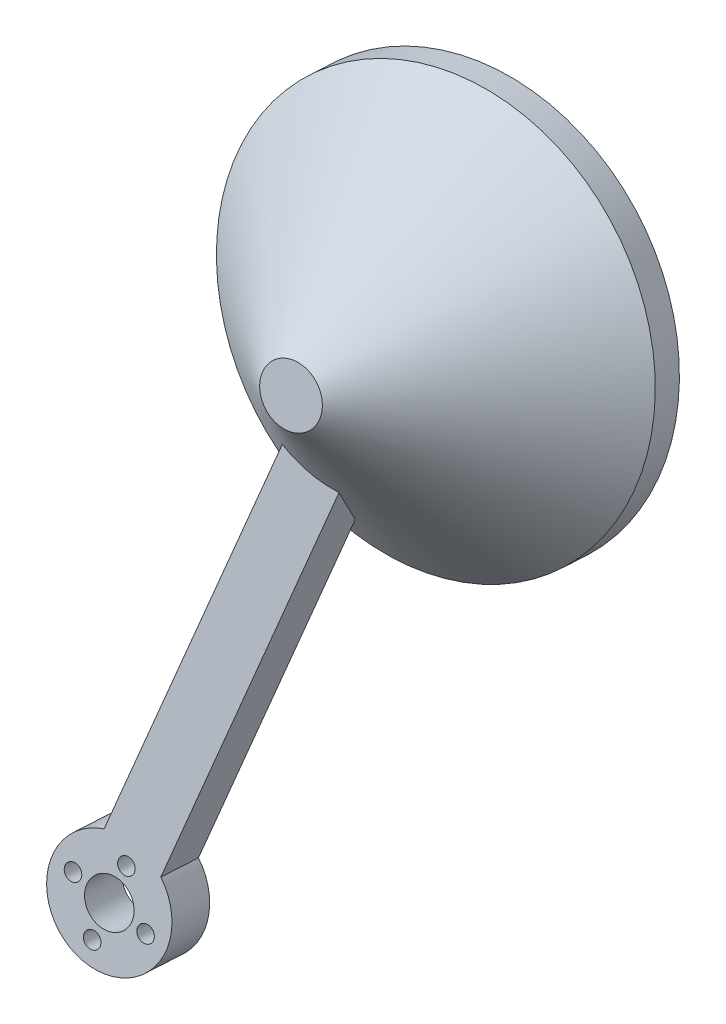
ISO-10303-21;
HEADER;
FILE_DESCRIPTION(('STEP AP214'),'2;1');
FILE_NAME('part.step','',(''),(''),'','','');
FILE_SCHEMA(('AUTOMOTIVE_DESIGN { 1 0 10303 214 1 1 1 1 }'));
ENDSEC;
DATA;
#1=APPLICATION_CONTEXT('core data for automotive mechanical design processes');
#2=APPLICATION_PROTOCOL_DEFINITION('international standard','automotive_design',2000,#1);
#3=PRODUCT_CONTEXT('',#1,'mechanical');
#4=PRODUCT('Part','Part','',(#3));
#5=PRODUCT_RELATED_PRODUCT_CATEGORY('part','',(#4));
#6=PRODUCT_DEFINITION_FORMATION('','',#4);
#7=PRODUCT_DEFINITION_CONTEXT('part definition',#1,'design');
#8=PRODUCT_DEFINITION('design','',#6,#7);
#9=PRODUCT_DEFINITION_SHAPE('','',#8);
#10=(LENGTH_UNIT() NAMED_UNIT(*) SI_UNIT(.MILLI.,.METRE.));
#11=(NAMED_UNIT(*) PLANE_ANGLE_UNIT() SI_UNIT($,.RADIAN.));
#12=(NAMED_UNIT(*) SI_UNIT($,.STERADIAN.) SOLID_ANGLE_UNIT());
#13=UNCERTAINTY_MEASURE_WITH_UNIT(LENGTH_MEASURE(1.E-05),#10,'distance_accuracy_value','');
#14=(GEOMETRIC_REPRESENTATION_CONTEXT(3) GLOBAL_UNCERTAINTY_ASSIGNED_CONTEXT((#13)) GLOBAL_UNIT_ASSIGNED_CONTEXT((#10,
#11,#12)) REPRESENTATION_CONTEXT('',''));
#15=CARTESIAN_POINT('',(0.,0.,0.));
#16=DIRECTION('',(0.,0.,1.));
#17=DIRECTION('',(1.,0.,0.));
#18=AXIS2_PLACEMENT_3D('',#15,#16,#17);
#19=CARTESIAN_POINT('',(1.94447874397873,-131.547241069375,14.3765382991109));
#20=DIRECTION('',(-0.116474855844791,-0.165016264225995,-0.979389218082797));
#21=DIRECTION('',(-0.951304696198871,0.301897346700111,0.0622685076536023));
#22=AXIS2_PLACEMENT_3D('',#19,#20,#21);
#23=PLANE('',#22);
#24=CARTESIAN_POINT('',(9.37461493685242,-107.102475734897,9.37422889352119));
#25=DIRECTION('',(-0.116474855844791,-0.165016264225995,-0.979389218082797));
#26=DIRECTION('',(0.,0.986100975614506,-0.166147121227302));
#27=AXIS2_PLACEMENT_3D('',#24,#25,#26);
#28=CIRCLE('',#27,5.08);
#29=CARTESIAN_POINT('',(9.37461493685242,-102.093082778776,8.5302015176865));
#30=VERTEX_POINT('',#29);
#31=EDGE_CURVE('P0_E149',#30,#30,#28,.T.);
#32=ORIENTED_EDGE('',*,*,#31,.F.);
#33=EDGE_LOOP('',(#32));
#34=FACE_BOUND('',#33,.T.);
#35=CARTESIAN_POINT('',(-5.78772582672569,-129.093419435396,14.8826567293194));
#36=DIRECTION('',(-0.116474855844791,-0.165016264225995,-0.979389218082797));
#37=DIRECTION('',(-0.951304696198871,0.301897346700111,0.0622685076536023));
#38=AXIS2_PLACEMENT_3D('',#35,#36,#37);
#39=CIRCLE('',#38,1.778);
#40=CARTESIAN_POINT('',(-7.47914557656728,-128.556645952963,14.9933701359275));
#41=VERTEX_POINT('',#40);
#42=EDGE_CURVE('P0_E134',#41,#41,#39,.T.);
#43=ORIENTED_EDGE('',*,*,#42,.F.);
#44=EDGE_LOOP('',(#43));
#45=FACE_BOUND('',#44,.T.);
#46=CARTESIAN_POINT('',(9.67668331468316,-134.001062703353,13.8704198689024));
#47=DIRECTION('',(-0.116474855844791,-0.165016264225995,-0.979389218082797));
#48=DIRECTION('',(-0.951304696198871,0.301897346700111,0.0622685076536023));
#49=AXIS2_PLACEMENT_3D('',#46,#47,#48);
#50=CIRCLE('',#49,1.778);
#51=CARTESIAN_POINT('',(7.98526356484157,-133.46428922092,13.9811332755105));
#52=VERTEX_POINT('',#51);
#53=EDGE_CURVE('P0_E122',#52,#52,#50,.T.);
#54=ORIENTED_EDGE('',*,*,#53,.F.);
#55=EDGE_LOOP('',(#54));
#56=FACE_BOUND('',#55,.T.);
#57=DIRECTION('',(0.285399689813967,0.938950278021328,-0.192144197044203));
#58=VECTOR('',#57,1.);
#59=CARTESIAN_POINT('',(-0.957331130423199,-119.303127038386,12.6586410236697));
#60=LINE('',#59,#58);
#61=CARTESIAN_POINT('',(-0.957331130423202,-119.303127038386,12.6586410236697));
#62=VERTEX_POINT('',#61);
#63=CARTESIAN_POINT('',(23.5229635188897,-38.7642186674649,-3.8226192112794));
#64=VERTEX_POINT('',#63);
#65=EDGE_CURVE('P0_E92',#62,#64,#60,.T.);
#66=ORIENTED_EDGE('',*,*,#65,.T.);
#67=DIRECTION('',(0.951304696198871,-0.301897346700111,-0.0622685076536023));
#68=VECTOR('',#67,1.);
#69=CARTESIAN_POINT('',(35.6045331606154,-42.5983149705563,-4.61342925848015));
#70=LINE('',#69,#68);
#71=CARTESIAN_POINT('',(35.6045331606154,-42.5983149705563,-4.61342925848015));
#72=VERTEX_POINT('',#71);
#73=EDGE_CURVE('P0_E87',#64,#72,#70,.T.);
#74=ORIENTED_EDGE('',*,*,#73,.T.);
#75=DIRECTION('',(-0.285399689813967,-0.938950278021328,0.192144197044203));
#76=VECTOR('',#75,1.);
#77=CARTESIAN_POINT('',(11.1242385113025,-123.137223341477,11.867830976469));
#78=LINE('',#77,#76);
#79=CARTESIAN_POINT('',(11.1242385113025,-123.137223341477,11.867830976469));
#80=VERTEX_POINT('',#79);
#81=EDGE_CURVE('P0_E90',#72,#80,#78,.T.);
#82=ORIENTED_EDGE('',*,*,#81,.T.);
#83=CARTESIAN_POINT('',(1.94447874397873,-131.547241069375,14.3765382991109));
#84=DIRECTION('',(-0.116474855844791,-0.165016264225995,-0.979389218082797));
#85=DIRECTION('',(-0.951304696198871,0.301897346700111,0.0622685076536023));
#86=AXIS2_PLACEMENT_3D('',#83,#84,#85);
#87=CIRCLE('',#86,12.7);
#88=EDGE_CURVE('P0_E57',#80,#62,#87,.T.);
#89=ORIENTED_EDGE('',*,*,#88,.T.);
#90=EDGE_LOOP('',(#66,#74,#82,#89));
#91=FACE_BOUND('',#90,.T.);
#92=CARTESIAN_POINT('',(1.94447874397873,-131.547241069375,14.3765382991109));
#93=DIRECTION('',(-0.116474855844791,-0.165016264225995,-0.979389218082797));
#94=DIRECTION('',(-0.951304696198871,0.301897346700111,0.0622685076536023));
#95=AXIS2_PLACEMENT_3D('',#92,#93,#94);
#96=CIRCLE('',#95,5.0165);
#97=CARTESIAN_POINT('',(-2.8277412645029,-130.032773029654,14.6889082677552));
#98=VERTEX_POINT('',#97);
#99=EDGE_CURVE('P0_E107',#98,#98,#96,.T.);
#100=ORIENTED_EDGE('',*,*,#99,.F.);
#101=EDGE_LOOP('',(#100));
#102=FACE_BOUND('',#101,.T.);
#103=CARTESIAN_POINT('',(4.26420742278666,-123.915453209617,12.8147902655356));
#104=DIRECTION('',(-0.116474855844791,-0.165016264225995,-0.979389218082797));
#105=DIRECTION('',(-0.951304696198871,0.301897346700111,0.0622685076536023));
#106=AXIS2_PLACEMENT_3D('',#103,#104,#105);
#107=CIRCLE('',#106,1.77800000000001);
#108=CARTESIAN_POINT('',(2.57278767294506,-123.378679727185,12.9255036721437));
#109=VERTEX_POINT('',#108);
#110=EDGE_CURVE('P0_E128',#109,#109,#107,.T.);
#111=ORIENTED_EDGE('',*,*,#110,.F.);
#112=EDGE_LOOP('',(#111));
#113=FACE_BOUND('',#112,.T.);
#114=CARTESIAN_POINT('',(-0.375249934829194,-139.179028929132,15.9382863326862));
#115=DIRECTION('',(-0.116474855844791,-0.165016264225995,-0.979389218082797));
#116=DIRECTION('',(-0.951304696198871,0.301897346700111,0.0622685076536023));
#117=AXIS2_PLACEMENT_3D('',#114,#115,#116);
#118=CIRCLE('',#117,1.778);
#119=CARTESIAN_POINT('',(-2.06666968467079,-138.642255446699,16.0489997392943));
#120=VERTEX_POINT('',#119);
#121=EDGE_CURVE('P0_E140',#120,#120,#118,.T.);
#122=ORIENTED_EDGE('',*,*,#121,.F.);
#123=EDGE_LOOP('',(#122));
#124=FACE_BOUND('',#123,.T.);
#125=ADVANCED_FACE('P0_F40',(#34,#45,#56,#91,#102,#113,#124),#23,.T.);
#126=CARTESIAN_POINT('',(3.09827866597724,-129.912589955952,24.0783678934391));
#127=DIRECTION('',(-0.116474855844791,-0.165016264225995,-0.979389218082797));
#128=DIRECTION('',(-0.951304696198871,0.301897346700111,0.0622685076536023));
#129=AXIS2_PLACEMENT_3D('',#126,#127,#128);
#130=PLANE('',#129);
#131=DIRECTION('',(0.285399689813967,0.938950278021328,-0.192144197044203));
#132=VECTOR('',#131,1.);
#133=CARTESIAN_POINT('',(0.196468791575304,-117.668475924963,22.3604706179979));
#134=LINE('',#133,#132);
#135=CARTESIAN_POINT('',(0.1964687915753,-117.668475924963,22.3604706179979));
#136=VERTEX_POINT('',#135);
#137=CARTESIAN_POINT('',(24.6767634408882,-37.1295675540422,5.87921038304878));
#138=VERTEX_POINT('',#137);
#139=EDGE_CURVE('P0_E104',#136,#138,#134,.T.);
#140=ORIENTED_EDGE('',*,*,#139,.F.);
#141=CARTESIAN_POINT('',(3.09827866597724,-129.912589955952,24.0783678934391));
#142=DIRECTION('',(-0.116474855844791,-0.165016264225995,-0.979389218082797));
#143=DIRECTION('',(-0.951304696198871,0.301897346700111,0.0622685076536023));
#144=AXIS2_PLACEMENT_3D('',#141,#142,#143);
#145=CIRCLE('',#144,12.7);
#146=CARTESIAN_POINT('',(12.278038433301,-121.502572228055,21.5696605707971));
#147=VERTEX_POINT('',#146);
#148=EDGE_CURVE('P0_E80',#147,#136,#145,.T.);
#149=ORIENTED_EDGE('',*,*,#148,.F.);
#150=DIRECTION('',(-0.285399689813967,-0.938950278021328,0.192144197044203));
#151=VECTOR('',#150,1.);
#152=CARTESIAN_POINT('',(12.278038433301,-121.502572228055,21.5696605707971));
#153=LINE('',#152,#151);
#154=CARTESIAN_POINT('',(36.7583330826139,-40.9636638571336,5.08840033584803));
#155=VERTEX_POINT('',#154);
#156=EDGE_CURVE('P0_E74',#155,#147,#153,.T.);
#157=ORIENTED_EDGE('',*,*,#156,.F.);
#158=DIRECTION('',(0.951304696198871,-0.301897346700111,-0.0622685076536023));
#159=VECTOR('',#158,1.);
#160=CARTESIAN_POINT('',(36.7583330826139,-40.9636638571336,5.08840033584803));
#161=LINE('',#160,#159);
#162=EDGE_CURVE('P0_E96',#138,#155,#161,.T.);
#163=ORIENTED_EDGE('',*,*,#162,.F.);
#164=EDGE_LOOP('',(#140,#149,#157,#163));
#165=FACE_BOUND('',#164,.T.);
#166=CARTESIAN_POINT('',(3.09827866597724,-129.912589955952,24.0783678934391));
#167=DIRECTION('',(-0.116474855844791,-0.165016264225995,-0.979389218082797));
#168=DIRECTION('',(-0.951304696198871,0.301897346700111,0.0622685076536023));
#169=AXIS2_PLACEMENT_3D('',#166,#167,#168);
#170=CIRCLE('',#169,5.0165);
#171=CARTESIAN_POINT('',(-1.6739413425044,-128.398121916231,24.3907378620834));
#172=VERTEX_POINT('',#171);
#173=EDGE_CURVE('P0_E119',#172,#172,#170,.T.);
#174=ORIENTED_EDGE('',*,*,#173,.T.);
#175=EDGE_LOOP('',(#174));
#176=FACE_BOUND('',#175,.T.);
#177=CARTESIAN_POINT('',(10.8304832366817,-132.366411589931,23.5722494632306));
#178=DIRECTION('',(-0.116474855844791,-0.165016264225995,-0.979389218082797));
#179=DIRECTION('',(-0.951304696198871,0.301897346700111,0.0622685076536023));
#180=AXIS2_PLACEMENT_3D('',#177,#178,#179);
#181=CIRCLE('',#180,1.778);
#182=CARTESIAN_POINT('',(9.13906348684007,-131.829638107498,23.6829628698387));
#183=VERTEX_POINT('',#182);
#184=EDGE_CURVE('P0_E125',#183,#183,#181,.T.);
#185=ORIENTED_EDGE('',*,*,#184,.T.);
#186=EDGE_LOOP('',(#185));
#187=FACE_BOUND('',#186,.T.);
#188=CARTESIAN_POINT('',(5.41800734478516,-122.280802096195,22.5166198598638));
#189=DIRECTION('',(-0.116474855844791,-0.165016264225995,-0.979389218082797));
#190=DIRECTION('',(-0.951304696198871,0.301897346700111,0.0622685076536023));
#191=AXIS2_PLACEMENT_3D('',#188,#189,#190);
#192=CIRCLE('',#191,1.77800000000001);
#193=CARTESIAN_POINT('',(3.72658759494356,-121.744028613762,22.6273332664719));
#194=VERTEX_POINT('',#193);
#195=EDGE_CURVE('P0_E131',#194,#194,#192,.T.);
#196=ORIENTED_EDGE('',*,*,#195,.T.);
#197=EDGE_LOOP('',(#196));
#198=FACE_BOUND('',#197,.T.);
#199=CARTESIAN_POINT('',(-4.63392590472719,-127.458768321974,24.5844863236475));
#200=DIRECTION('',(-0.116474855844791,-0.165016264225995,-0.979389218082797));
#201=DIRECTION('',(-0.951304696198871,0.301897346700111,0.0622685076536023));
#202=AXIS2_PLACEMENT_3D('',#199,#200,#201);
#203=CIRCLE('',#202,1.778);
#204=CARTESIAN_POINT('',(-6.32534565456878,-126.921994839541,24.6951997302556));
#205=VERTEX_POINT('',#204);
#206=EDGE_CURVE('P0_E137',#205,#205,#203,.T.);
#207=ORIENTED_EDGE('',*,*,#206,.T.);
#208=EDGE_LOOP('',(#207));
#209=FACE_BOUND('',#208,.T.);
#210=CARTESIAN_POINT('',(0.778549987169308,-137.544377815709,25.6401159270143));
#211=DIRECTION('',(-0.116474855844791,-0.165016264225995,-0.979389218082797));
#212=DIRECTION('',(-0.951304696198871,0.301897346700111,0.0622685076536023));
#213=AXIS2_PLACEMENT_3D('',#210,#211,#212);
#214=CIRCLE('',#213,1.778);
#215=CARTESIAN_POINT('',(-0.912869762672288,-137.007604333277,25.7508293336225));
#216=VERTEX_POINT('',#215);
#217=EDGE_CURVE('P0_E143',#216,#216,#214,.T.);
#218=ORIENTED_EDGE('',*,*,#217,.T.);
#219=EDGE_LOOP('',(#218));
#220=FACE_BOUND('',#219,.T.);
#221=ADVANCED_FACE('P0_F115',(#165,#176,#187,#198,#209,#220),#130,.F.);
#222=CARTESIAN_POINT('',(-0.957331130423199,-119.303127038386,12.6586410236697));
#223=DIRECTION('',(0.951304696198871,-0.301897346700111,-0.0622685076536023));
#224=DIRECTION('',(-0.285399689813967,-0.938950278021328,0.192144197044203));
#225=AXIS2_PLACEMENT_3D('',#222,#223,#224);
#226=PLANE('',#225);
#227=ORIENTED_EDGE('',*,*,#139,.T.);
#228=DIRECTION('',(0.116474855844791,0.165016264225995,0.979389218082797));
#229=VECTOR('',#228,1.);
#230=CARTESIAN_POINT('',(23.5229635188897,-38.7642186674649,-3.8226192112794));
#231=LINE('',#230,#229);
#232=EDGE_CURVE('P0_E11',#64,#138,#231,.T.);
#233=ORIENTED_EDGE('',*,*,#232,.F.);
#234=ORIENTED_EDGE('',*,*,#65,.F.);
#235=DIRECTION('',(0.116474855844791,0.165016264225995,0.979389218082797));
#236=VECTOR('',#235,1.);
#237=CARTESIAN_POINT('',(-0.957331130423202,-119.303127038386,12.6586410236697));
#238=LINE('',#237,#236);
#239=EDGE_CURVE('P0_E100',#62,#136,#238,.T.);
#240=ORIENTED_EDGE('',*,*,#239,.T.);
#241=EDGE_LOOP('',(#227,#233,#234,#240));
#242=FACE_BOUND('',#241,.T.);
#243=ADVANCED_FACE('P0_F42',(#242),#226,.F.);
#244=CARTESIAN_POINT('',(35.6045331606154,-42.5983149705563,-4.61342925848015));
#245=DIRECTION('',(-0.285399689813967,-0.938950278021328,0.192144197044203));
#246=DIRECTION('',(-0.951304696198871,0.301897346700111,0.0622685076536023));
#247=AXIS2_PLACEMENT_3D('',#244,#245,#246);
#248=PLANE('',#247);
#249=ORIENTED_EDGE('',*,*,#162,.T.);
#250=DIRECTION('',(0.116474855844791,0.165016264225995,0.979389218082797));
#251=VECTOR('',#250,1.);
#252=CARTESIAN_POINT('',(35.6045331606154,-42.5983149705563,-4.61342925848015));
#253=LINE('',#252,#251);
#254=EDGE_CURVE('P0_E49',#72,#155,#253,.T.);
#255=ORIENTED_EDGE('',*,*,#254,.F.);
#256=ORIENTED_EDGE('',*,*,#73,.F.);
#257=ORIENTED_EDGE('',*,*,#232,.T.);
#258=EDGE_LOOP('',(#249,#255,#256,#257));
#259=FACE_BOUND('',#258,.T.);
#260=ADVANCED_FACE('P0_F95',(#259),#248,.F.);
#261=CARTESIAN_POINT('',(11.1242385113025,-123.137223341477,11.867830976469));
#262=DIRECTION('',(-0.951304696198871,0.301897346700111,0.0622685076536023));
#263=DIRECTION('',(0.116474855844791,0.165016264225995,0.979389218082797));
#264=AXIS2_PLACEMENT_3D('',#261,#262,#263);
#265=PLANE('',#264);
#266=ORIENTED_EDGE('',*,*,#156,.T.);
#267=DIRECTION('',(0.116474855844791,0.165016264225995,0.979389218082797));
#268=VECTOR('',#267,1.);
#269=CARTESIAN_POINT('',(11.1242385113025,-123.137223341477,11.867830976469));
#270=LINE('',#269,#268);
#271=EDGE_CURVE('P0_E97',#80,#147,#270,.T.);
#272=ORIENTED_EDGE('',*,*,#271,.F.);
#273=ORIENTED_EDGE('',*,*,#81,.F.);
#274=ORIENTED_EDGE('',*,*,#254,.T.);
#275=EDGE_LOOP('',(#266,#272,#273,#274));
#276=FACE_BOUND('',#275,.T.);
#277=ADVANCED_FACE('P0_F98',(#276),#265,.F.);
#278=CARTESIAN_POINT('',(1.94447874397873,-131.547241069375,14.3765382991109));
#279=DIRECTION('',(0.116474855844791,0.165016264225995,0.979389218082797));
#280=DIRECTION('',(0.951304696198871,-0.301897346700111,-0.0622685076536023));
#281=AXIS2_PLACEMENT_3D('',#278,#279,#280);
#282=CYLINDRICAL_SURFACE('',#281,12.7);
#283=ORIENTED_EDGE('',*,*,#148,.T.);
#284=ORIENTED_EDGE('',*,*,#239,.F.);
#285=ORIENTED_EDGE('',*,*,#88,.F.);
#286=ORIENTED_EDGE('',*,*,#271,.T.);
#287=EDGE_LOOP('',(#283,#284,#285,#286));
#288=FACE_BOUND('',#287,.T.);
#289=ADVANCED_FACE('P0_F112',(#288),#282,.T.);
#290=CARTESIAN_POINT('',(1.94447874397873,-131.547241069375,14.3765382991109));
#291=DIRECTION('',(0.116474855844791,0.165016264225995,0.979389218082797));
#292=DIRECTION('',(0.951304696198871,-0.301897346700111,-0.0622685076536023));
#293=AXIS2_PLACEMENT_3D('',#290,#291,#292);
#294=CYLINDRICAL_SURFACE('',#293,5.0165);
#295=ORIENTED_EDGE('',*,*,#99,.T.);
#296=EDGE_LOOP('',(#295));
#297=FACE_BOUND('',#296,.T.);
#298=ORIENTED_EDGE('',*,*,#173,.F.);
#299=EDGE_LOOP('',(#298));
#300=FACE_BOUND('',#299,.T.);
#301=ADVANCED_FACE('P0_F175',(#297,#300),#294,.F.);
#302=CARTESIAN_POINT('',(9.67668331468316,-134.001062703353,13.8704198689024));
#303=DIRECTION('',(0.116474855844791,0.165016264225995,0.979389218082797));
#304=DIRECTION('',(0.951304696198871,-0.301897346700111,-0.0622685076536023));
#305=AXIS2_PLACEMENT_3D('',#302,#303,#304);
#306=CYLINDRICAL_SURFACE('',#305,1.778);
#307=ORIENTED_EDGE('',*,*,#53,.T.);
#308=EDGE_LOOP('',(#307));
#309=FACE_BOUND('',#308,.T.);
#310=ORIENTED_EDGE('',*,*,#184,.F.);
#311=EDGE_LOOP('',(#310));
#312=FACE_BOUND('',#311,.T.);
#313=ADVANCED_FACE('P0_F171',(#309,#312),#306,.F.);
#314=CARTESIAN_POINT('',(4.26420742278666,-123.915453209617,12.8147902655356));
#315=DIRECTION('',(0.116474855844791,0.165016264225995,0.979389218082797));
#316=DIRECTION('',(0.951304696198871,-0.301897346700111,-0.0622685076536023));
#317=AXIS2_PLACEMENT_3D('',#314,#315,#316);
#318=CYLINDRICAL_SURFACE('',#317,1.77800000000001);
#319=ORIENTED_EDGE('',*,*,#110,.T.);
#320=EDGE_LOOP('',(#319));
#321=FACE_BOUND('',#320,.T.);
#322=ORIENTED_EDGE('',*,*,#195,.F.);
#323=EDGE_LOOP('',(#322));
#324=FACE_BOUND('',#323,.T.);
#325=ADVANCED_FACE('P0_F174',(#321,#324),#318,.F.);
#326=CARTESIAN_POINT('',(-5.78772582672569,-129.093419435396,14.8826567293194));
#327=DIRECTION('',(0.116474855844791,0.165016264225995,0.979389218082797));
#328=DIRECTION('',(0.951304696198871,-0.301897346700111,-0.0622685076536023));
#329=AXIS2_PLACEMENT_3D('',#326,#327,#328);
#330=CYLINDRICAL_SURFACE('',#329,1.778);
#331=ORIENTED_EDGE('',*,*,#42,.T.);
#332=EDGE_LOOP('',(#331));
#333=FACE_BOUND('',#332,.T.);
#334=ORIENTED_EDGE('',*,*,#206,.F.);
#335=EDGE_LOOP('',(#334));
#336=FACE_BOUND('',#335,.T.);
#337=ADVANCED_FACE('P0_F189',(#333,#336),#330,.F.);
#338=CARTESIAN_POINT('',(-0.375249934829194,-139.179028929132,15.9382863326862));
#339=DIRECTION('',(0.116474855844791,0.165016264225995,0.979389218082797));
#340=DIRECTION('',(0.951304696198871,-0.301897346700111,-0.0622685076536023));
#341=AXIS2_PLACEMENT_3D('',#338,#339,#340);
#342=CYLINDRICAL_SURFACE('',#341,1.778);
#343=ORIENTED_EDGE('',*,*,#121,.T.);
#344=EDGE_LOOP('',(#343));
#345=FACE_BOUND('',#344,.T.);
#346=ORIENTED_EDGE('',*,*,#217,.F.);
#347=EDGE_LOOP('',(#346));
#348=FACE_BOUND('',#347,.T.);
#349=ADVANCED_FACE('P0_F160',(#345,#348),#342,.F.);
#350=CARTESIAN_POINT('',(10.2621533383897,-105.845051801495,16.8371747353121));
#351=DIRECTION('',(-0.116474855844791,-0.165016264225995,-0.979389218082796));
#352=DIRECTION('',(0.,0.986100975614506,-0.166147121227302));
#353=AXIS2_PLACEMENT_3D('',#350,#351,#352);
#354=CYLINDRICAL_SURFACE('',#353,5.08);
#355=CARTESIAN_POINT('',(10.2621533383897,-105.845051801495,16.8371747353121));
#356=DIRECTION('',(-0.116474855844791,-0.165016264225995,-0.979389218082797));
#357=DIRECTION('',(0.,0.986100975614506,-0.166147121227302));
#358=AXIS2_PLACEMENT_3D('',#355,#356,#357);
#359=CIRCLE('',#358,5.08);
#360=CARTESIAN_POINT('',(10.2621533383897,-100.835658845374,15.9931473594774));
#361=VERTEX_POINT('',#360);
#362=EDGE_CURVE('P0_E146',#361,#361,#359,.T.);
#363=ORIENTED_EDGE('',*,*,#362,.F.);
#364=EDGE_LOOP('',(#363));
#365=FACE_BOUND('',#364,.T.);
#366=ORIENTED_EDGE('',*,*,#31,.T.);
#367=EDGE_LOOP('',(#366));
#368=FACE_BOUND('',#367,.T.);
#369=ADVANCED_FACE('P0_F157',(#365,#368),#354,.F.);
#370=CARTESIAN_POINT('',(10.2621533383897,-105.845051801495,16.8371747353121));
#371=DIRECTION('',(-0.116474855844791,-0.165016264225995,-0.979389218082797));
#372=DIRECTION('',(0.,0.986100975614506,-0.166147121227302));
#373=AXIS2_PLACEMENT_3D('',#370,#371,#372);
#374=PLANE('',#373);
#375=ORIENTED_EDGE('',*,*,#362,.T.);
#376=EDGE_LOOP('',(#375));
#377=FACE_BOUND('',#376,.T.);
#378=ADVANCED_FACE('P0_F155',(#377),#374,.T.);
#379=CLOSED_SHELL('',(#125,#221,#243,#260,#277,#289,#301,#313,#325,#337,#349,#369,#378));
#380=MANIFOLD_SOLID_BREP('P0_B2',#379);
#381=CARTESIAN_POINT('',(39.3872586353692,-14.5426033843329,19.1317940753642));
#382=DIRECTION('',(0.116474855844791,0.165016264225995,0.979389218082796));
#383=DIRECTION('',(-0.951304696198871,0.301897346700111,0.0622685076536022));
#384=AXIS2_PLACEMENT_3D('',#381,#382,#383);
#385=PLANE('',#384);
#386=CARTESIAN_POINT('',(39.3872586353692,-14.5426033843329,19.1317940753642));
#387=DIRECTION('',(-0.116474855844791,-0.165016264225995,-0.979389218082796));
#388=DIRECTION('',(0.951304696198871,-0.301897346700111,-0.0622685076536022));
#389=AXIS2_PLACEMENT_3D('',#386,#387,#388);
#390=CIRCLE('',#389,6.35);
#391=CARTESIAN_POINT('',(45.428043456232,-16.4596515358786,18.7363890517638));
#392=VERTEX_POINT('',#391);
#393=EDGE_CURVE('P1_E112',#392,#392,#390,.T.);
#394=ORIENTED_EDGE('',*,*,#393,.F.);
#395=EDGE_LOOP('',(#394));
#396=FACE_BOUND('',#395,.T.);
#397=ADVANCED_FACE('P1_F16',(#396),#385,.T.);
#398=CARTESIAN_POINT('',(34.9495666276827,-20.8297230513433,-18.1829351335903));
#399=DIRECTION('',(-0.116474855844791,-0.165016264225995,-0.979389218082796));
#400=DIRECTION('',(0.951304696198871,-0.301897346700111,-0.0622685076536022));
#401=AXIS2_PLACEMENT_3D('',#398,#399,#400);
#402=CONICAL_SURFACE('',#401,44.45,0.785398163397448);
#403=CARTESIAN_POINT('',(31.8304753872764,-17.2770681802347,18.9185927952907));
#404=CARTESIAN_POINT('',(31.7710334970948,-17.4509106649703,18.8533147832033));
#405=CARTESIAN_POINT('',(31.7117317032606,-17.6237470518663,18.7852992082369));
#406=CARTESIAN_POINT('',(31.5934120406876,-17.9675573479961,18.6445758342752));
#407=CARTESIAN_POINT('',(31.5343941184154,-18.1385316167528,18.5718689605056));
#408=CARTESIAN_POINT('',(31.4166657745706,-18.4787107501197,18.4225744140424));
#409=CARTESIAN_POINT('',(31.3579551591261,-18.6479168211022,18.3459896283514));
#410=CARTESIAN_POINT('',(31.240778886086,-18.9848657854125,18.189468444615));
#411=CARTESIAN_POINT('',(31.1823132424644,-19.1526085958467,18.109531858161));
#412=CARTESIAN_POINT('',(31.0074864403341,-19.6532256190588,17.8657712889857));
#413=CARTESIAN_POINT('',(30.8914655175852,-19.9841518199928,17.697700669548));
#414=CARTESIAN_POINT('',(30.660170624471,-20.6419100581167,17.3531211706141));
#415=CARTESIAN_POINT('',(30.544896823873,-20.9687411795175,17.1766104446972));
#416=CARTESIAN_POINT('',(30.315237029479,-21.6183619735484,16.8175582094929));
#417=CARTESIAN_POINT('',(30.200849649573,-21.9411588932488,16.6350306600421));
#418=CARTESIAN_POINT('',(29.9726106308746,-22.5840408830864,16.2650124238803));
#419=CARTESIAN_POINT('',(29.8587589507499,-22.904126164019,16.0775221277208));
#420=CARTESIAN_POINT('',(29.6314218165574,-23.5423035072066,15.6984727874577));
#421=CARTESIAN_POINT('',(29.5179366383809,-23.86039418678,15.5069112545984));
#422=CARTESIAN_POINT('',(29.2913308235985,-24.4947686226686,15.1205969251592));
#423=CARTESIAN_POINT('',(29.1782101940972,-24.8110523438594,14.9258440668279));
#424=CARTESIAN_POINT('',(28.953223311889,-25.4394682549843,14.5353741109656));
#425=CARTESIAN_POINT('',(28.8413544857157,-25.7516130339708,14.3396787330975));
#426=CARTESIAN_POINT('',(28.6178745361308,-26.3746516070673,13.9461598523643));
#427=CARTESIAN_POINT('',(28.5062634138633,-26.6855453956274,13.7483363400721));
#428=CARTESIAN_POINT('',(28.1717544005116,-27.6166548799381,13.1522001241832));
#429=CARTESIAN_POINT('',(27.9491851545404,-28.2352867142292,12.7512292240286));
#430=CARTESIAN_POINT('',(27.504684651417,-29.4694827640208,11.9441614904677));
#431=CARTESIAN_POINT('',(27.2827534375557,-30.0850467733532,11.5380643188691));
#432=CARTESIAN_POINT('',(26.8393885377735,-31.3138188824226,10.7220487472731));
#433=CARTESIAN_POINT('',(26.6179548540762,-31.9270269716392,10.3121303302398));
#434=CARTESIAN_POINT('',(26.1754942425482,-33.1515654571428,9.48940404605059));
#435=CARTESIAN_POINT('',(25.9544672820676,-33.7628960070449,9.07659642486028));
#436=CARTESIAN_POINT('',(25.5127213726141,-34.9841128439867,8.24868457480651));
#437=CARTESIAN_POINT('',(25.2920024243548,-35.593999127682,7.83358034063226));
#438=CARTESIAN_POINT('',(24.6302351427598,-37.4218773417499,6.58558608507192));
#439=CARTESIAN_POINT('',(24.1895558352453,-38.6381454489561,5.74997620336102));
#440=CARTESIAN_POINT('',(23.3076998405408,-41.0708040603052,4.07175116027181));
#441=CARTESIAN_POINT('',(22.8665248988093,-42.2871864548259,3.22912334706334));
#442=CARTESIAN_POINT('',(21.984642144134,-44.7177774605832,1.54046507612747));
#443=CARTESIAN_POINT('',(21.5439343363977,-45.9319860476887,0.694434580961938));
#444=CARTESIAN_POINT('',(20.6628834611202,-48.3587533249429,-1.00005332561979));
#445=CARTESIAN_POINT('',(20.2225403783177,-49.5713120856488,-1.84851062810704));
#446=CARTESIAN_POINT('',(19.3421144066913,-51.9952282955192,-3.54727446662313));
#447=CARTESIAN_POINT('',(18.9020315179355,-53.2065857443702,-4.39758100313427));
#448=CARTESIAN_POINT('',(18.0023540793854,-55.6826263219298,-6.13774301685506));
#449=CARTESIAN_POINT('',(17.5427687283244,-56.9472670397362,-7.02766358219265));
#450=CARTESIAN_POINT('',(16.6237646376365,-59.4757730153381,-8.80871898767563));
#451=CARTESIAN_POINT('',(16.1643458996239,-60.7396382656976,-9.69985383920905));
#452=CARTESIAN_POINT('',(15.2465685795387,-63.2642016261432,-11.48128234532));
#453=CARTESIAN_POINT('',(14.7882097249598,-64.5249009904198,-12.3715740823877));
#454=CARTESIAN_POINT('',(13.8716068924984,-67.0457797586595,-14.1529234637256));
#455=CARTESIAN_POINT('',(13.4133629135142,-68.3059591676893,-15.0439811002583));
#456=CARTESIAN_POINT('',(12.9551617491599,-69.565941800069,-15.935338673161));
#457=B_SPLINE_CURVE_WITH_KNOTS('',3,(#403,#404,#405,#406,#407,#408,#409,#410,#411,#412,#413,
#414,#415,#416,#417,#418,#419,#420,#421,#422,#423,#424,#425,#426,#427,#428,#429,#430,#431,#432,
#433,#434,#435,#436,#437,#438,#439,#440,#441,#442,#443,#444,#445,#446,#447,#448,#449,#450,#451,
#452,#453,#454,#455,#456),.UNSPECIFIED.,.F.,.F.,(4,2,2,2,2,2,2,2,2,2,2,2,2,2,2,2,2,2,2,2,2,2,2,
2,2,2,4),(0.,0.584873434777491,1.16963187034444,1.75396119221149,2.33832340406906,
3.50476340115452,4.67145975538487,5.83561719336928,6.99968328684385,8.16448269926701,
9.32930467699808,10.4843756612337,11.6394517642835,13.9496482548881,16.2599979595653,
18.570357969198,20.880523627915,23.1906946309988,27.8108220401931,32.4431141601348,
37.0754573872492,41.7075958529221,46.3397355268327,51.1794083555052,56.0191268891485,
60.8491034038748,65.6790316849975),.UNSPECIFIED.);
#458=CARTESIAN_POINT('',(24.3678784183194,-38.145783367054,6.08716598622113));
#459=VERTEX_POINT('',#458);
#460=CARTESIAN_POINT('',(20.3180157646546,-49.3083316861037,-1.66490098387859));
#461=VERTEX_POINT('',#460);
#462=EDGE_CURVE('P1_E11',#459,#461,#457,.T.);
#463=ORIENTED_EDGE('',*,*,#462,.F.);
#464=CARTESIAN_POINT('',(37.2417851708984,-17.5822123500203,1.09138901501792));
#465=DIRECTION('',(0.116474855844791,0.165016264225995,0.979389218082796));
#466=DIRECTION('',(-0.951304696198871,0.301897346700111,0.0622685076536022));
#467=AXIS2_PLACEMENT_3D('',#464,#465,#466);
#468=CIRCLE('',#467,24.7700568346681);
#469=CARTESIAN_POINT('',(36.4494480600451,-41.9798796701454,5.29635593902039));
#470=VERTEX_POINT('',#469);
#471=EDGE_CURVE('P1_E29',#470,#459,#468,.F.);
#472=ORIENTED_EDGE('',*,*,#471,.F.);
#473=CARTESIAN_POINT('',(25.0367313908856,-73.4000381031604,-16.7261487203618));
#474=CARTESIAN_POINT('',(25.4258598742166,-72.3299960836116,-15.9691543931436));
#475=CARTESIAN_POINT('',(25.8150202015676,-71.259807636983,-15.2123834947766));
#476=CARTESIAN_POINT('',(26.5934173470443,-69.1190779534387,-13.6993835516961));
#477=CARTESIAN_POINT('',(26.9826541650664,-68.0485367169996,-12.9431545062549));
#478=CARTESIAN_POINT('',(28.1503551801404,-64.8366882947108,-10.6757010530649));
#479=CARTESIAN_POINT('',(28.928954820947,-62.6947580095676,-9.16542839035885));
#480=CARTESIAN_POINT('',(30.0970317575616,-59.4806271441355,-6.90329781408463));
#481=CARTESIAN_POINT('',(30.4863077494488,-58.4093541685896,-6.15001799321876));
#482=CARTESIAN_POINT('',(31.2650260914337,-56.2660377856926,-4.64465211657958));
#483=CARTESIAN_POINT('',(31.6544684407842,-55.1939943817879,-3.89256605551416));
#484=CARTESIAN_POINT('',(32.4336335067019,-53.0487409236032,-2.38976692281199));
#485=CARTESIAN_POINT('',(32.8233562605629,-51.9755306971323,-1.63905411625957));
#486=CARTESIAN_POINT('',(33.6030808309672,-49.8278317607044,-0.139563624717518));
#487=CARTESIAN_POINT('',(33.9930826519335,-48.7533430302976,0.609214028694519));
#488=CARTESIAN_POINT('',(34.7738995854382,-46.6014497401297,2.10505750625716));
#489=CARTESIAN_POINT('',(35.1647151162835,-45.5240432423715,2.85212032505216));
#490=CARTESIAN_POINT('',(35.9468099811431,-43.3670339289472,4.34268325615922));
#491=CARTESIAN_POINT('',(36.3380892870581,-42.2874312437638,5.08618357180396));
#492=CARTESIAN_POINT('',(36.9254187165423,-40.6659188232686,6.1974828417378));
#493=CARTESIAN_POINT('',(37.1212124916572,-40.1252045680167,6.56716150655973));
#494=CARTESIAN_POINT('',(37.5130059588251,-39.0428123066117,7.30499215613151));
#495=CARTESIAN_POINT('',(37.7090056501944,-38.5011343036539,7.67314414592941));
#496=CARTESIAN_POINT('',(38.1012954848322,-37.4164934785255,8.40765628467491));
#497=CARTESIAN_POINT('',(38.2975856792015,-36.8735304167671,8.77401605271634));
#498=CARTESIAN_POINT('',(38.6904768647017,-35.7861465282197,9.50441606997071));
#499=CARTESIAN_POINT('',(38.8870778597585,-35.2417256829555,9.86845628958725));
#500=CARTESIAN_POINT('',(39.2810172504737,-34.1500876762127,10.594244915578));
#501=CARTESIAN_POINT('',(39.4783563362381,-33.602867251451,10.9559880435947));
#502=CARTESIAN_POINT('',(39.8735155812159,-32.5061208879004,11.6756460219775));
#503=CARTESIAN_POINT('',(40.0713357193059,-31.9565950496027,12.0335610368432));
#504=CARTESIAN_POINT('',(40.467481187389,-30.8548630407774,12.7441140209062));
#505=CARTESIAN_POINT('',(40.6658061125479,-30.3026588129088,13.0967552238874));
#506=CARTESIAN_POINT('',(41.0633198898573,-29.1941280331437,13.7952499148746));
#507=CARTESIAN_POINT('',(41.2625088758725,-28.637800832295,14.141102301667));
#508=CARTESIAN_POINT('',(41.5623763231191,-27.7984763617602,14.6530060123726));
#509=CARTESIAN_POINT('',(41.6626358463704,-27.517550050746,14.8226976878647));
#510=CARTESIAN_POINT('',(41.8634851768053,-26.9540433832918,15.1591076053056));
#511=CARTESIAN_POINT('',(41.9640749788786,-26.671463052392,15.3258258930075));
#512=CARTESIAN_POINT('',(42.1655983284118,-26.1044556153516,15.6555602768331));
#513=CARTESIAN_POINT('',(42.2665316999329,-25.8200294017581,15.8185780124085));
#514=CARTESIAN_POINT('',(42.4688639721439,-25.2487852348987,16.1401296796738));
#515=CARTESIAN_POINT('',(42.5702629012097,-24.9619671349527,16.2986633337241));
#516=CARTESIAN_POINT('',(42.7738445768913,-24.3847700066574,16.6104408808701));
#517=CARTESIAN_POINT('',(42.8760286150195,-24.094384125101,16.763671278489));
#518=CARTESIAN_POINT('',(43.0810219835332,-23.510135668732,17.0628288473336));
#519=CARTESIAN_POINT('',(43.1838311996039,-23.2162737207544,17.2087573112143));
#520=CARTESIAN_POINT('',(43.3386793235025,-22.7720288455622,17.4206043403741));
#521=CARTESIAN_POINT('',(43.3904422503893,-22.6232529221756,17.4900978785403));
#522=CARTESIAN_POINT('',(43.4941643639795,-22.3245111471764,17.6263141595609));
#523=CARTESIAN_POINT('',(43.5461235422853,-22.1745453461828,17.6930370195391));
#524=CARTESIAN_POINT('',(43.6502811460143,-21.8732086504001,17.8233254905129));
#525=CARTESIAN_POINT('',(43.702479695356,-21.7218369729389,17.8868892000288));
#526=CARTESIAN_POINT('',(43.8070975595483,-21.4176270677448,18.0102790576621));
#527=CARTESIAN_POINT('',(43.8595169059919,-21.2647886258411,18.0701046500737));
#528=CARTESIAN_POINT('',(43.9120450290021,-21.1111644833261,18.12778274809));
#529=B_SPLINE_CURVE_WITH_KNOTS('',3,(#473,#474,#475,#476,#477,#478,#479,#480,#481,#482,#483,
#484,#485,#486,#487,#488,#489,#490,#491,#492,#493,#494,#495,#496,#497,#498,#499,#500,#501,#502,
#503,#504,#505,#506,#507,#508,#509,#510,#511,#512,#513,#514,#515,#516,#517,#518,#519,#520,#521,
#522,#523,#524,#525,#526,#527,#528),.UNSPECIFIED.,.F.,.F.,(4,2,2,2,2,2,2,2,2,2,2,2,2,2,2,2,2,2,
2,2,2,2,2,2,2,2,2,4),(0.,4.10183625147547,8.20366698339807,16.4058011214059,20.504498988406,
24.6031786341775,28.7025800018154,32.8020478458569,36.9062854181194,41.0102858787057,
43.0612166919341,45.1121407181936,47.1634831853432,49.2148517744932,51.2698977843133,
53.3248551281517,55.3784959872468,57.4324672595365,58.4619692959549,59.4914554772096,
60.5204762952816,61.5495606880933,62.5810956378231,63.6124473250194,64.1289403695138,
64.6454115582278,65.1621899348084,65.6790449534031),.UNSPECIFIED.);
#530=CARTESIAN_POINT('',(32.3995854063803,-53.1424279891951,-2.45571103107934));
#531=VERTEX_POINT('',#530);
#532=EDGE_CURVE('P1_E119',#531,#470,#529,.T.);
#533=ORIENTED_EDGE('',*,*,#532,.F.);
#534=CARTESIAN_POINT('',(36.0879852488999,-19.216863463443,-8.61044057931027));
#535=DIRECTION('',(-0.116474855844791,-0.165016264225995,-0.979389218082796));
#536=DIRECTION('',(0.951304696198871,-0.301897346700111,-0.0622685076536022));
#537=AXIS2_PLACEMENT_3D('',#534,#535,#536);
#538=CIRCLE('',#537,34.6760568346681);
#539=EDGE_CURVE('P1_E116',#461,#531,#538,.F.);
#540=ORIENTED_EDGE('',*,*,#539,.F.);
#541=EDGE_LOOP('',(#463,#472,#533,#540));
#542=FACE_BOUND('',#541,.T.);
#543=ORIENTED_EDGE('',*,*,#393,.T.);
#544=EDGE_LOOP('',(#543));
#545=FACE_BOUND('',#544,.T.);
#546=CARTESIAN_POINT('',(34.9495666276827,-20.8297230513433,-18.1829351335903));
#547=DIRECTION('',(-0.116474855844791,-0.165016264225995,-0.979389218082796));
#548=DIRECTION('',(0.951304696198871,-0.301897346700111,-0.0622685076536022));
#549=AXIS2_PLACEMENT_3D('',#546,#547,#548);
#550=CIRCLE('',#549,44.45);
#551=CARTESIAN_POINT('',(77.2350603737225,-34.2490601121632,-20.9507702987929));
#552=VERTEX_POINT('',#551);
#553=EDGE_CURVE('P1_E108',#552,#552,#550,.T.);
#554=ORIENTED_EDGE('',*,*,#553,.F.);
#555=EDGE_LOOP('',(#554));
#556=FACE_BOUND('',#555,.T.);
#557=ADVANCED_FACE('P1_F126',(#542,#545,#556),#402,.T.);
#558=CARTESIAN_POINT('',(38.6476433007548,-15.5904566621679,12.9126725405385));
#559=DIRECTION('',(-0.116474855844791,-0.165016264225995,-0.979389218082796));
#560=DIRECTION('',(0.951304696198871,-0.301897346700111,-0.0622685076536022));
#561=AXIS2_PLACEMENT_3D('',#558,#559,#560);
#562=CYLINDRICAL_SURFACE('',#561,44.45);
#563=CARTESIAN_POINT('',(34.2099512930682,-21.8775763291783,-24.4020566684161));
#564=DIRECTION('',(-0.116474855844791,-0.165016264225995,-0.979389218082796));
#565=DIRECTION('',(0.951304696198871,-0.301897346700111,-0.0622685076536022));
#566=AXIS2_PLACEMENT_3D('',#563,#564,#565);
#567=CIRCLE('',#566,44.45);
#568=CARTESIAN_POINT('',(76.495445039108,-35.2969133899983,-27.1698918336187));
#569=VERTEX_POINT('',#568);
#570=EDGE_CURVE('P1_E104',#569,#569,#567,.T.);
#571=CARTESIAN_POINT('',(77.2350603737225,-34.2490601121632,-20.9507702987929));
#572=CARTESIAN_POINT('',(77.2273560473202,-34.259975250474,-21.0155528147807));
#573=CARTESIAN_POINT('',(77.219651720918,-34.2708903887848,-21.0803353307685));
#574=CARTESIAN_POINT('',(77.2042430681135,-34.2927206654063,-21.209900362744));
#575=CARTESIAN_POINT('',(77.1965387417113,-34.3036358037171,-21.2746828787318));
#576=CARTESIAN_POINT('',(77.1811300889068,-34.3254660803387,-21.4042479107073));
#577=CARTESIAN_POINT('',(77.1734257625046,-34.3363812186494,-21.4690304266951));
#578=CARTESIAN_POINT('',(77.1580171097001,-34.358211495271,-21.5985954586706));
#579=CARTESIAN_POINT('',(77.1503127832979,-34.3691266335818,-21.6633779746584));
#580=CARTESIAN_POINT('',(77.1349041304934,-34.3909569102034,-21.7929430066339));
#581=CARTESIAN_POINT('',(77.1271998040912,-34.4018720485141,-21.8577255226217));
#582=CARTESIAN_POINT('',(77.1117911512867,-34.4237023251357,-21.9872905545972));
#583=CARTESIAN_POINT('',(77.1040868248845,-34.4346174634465,-22.052073070585));
#584=CARTESIAN_POINT('',(77.08867817208,-34.4564477400681,-22.1816381025605));
#585=CARTESIAN_POINT('',(77.0809738456778,-34.4673628783788,-22.2464206185483));
#586=CARTESIAN_POINT('',(77.0655651928733,-34.4891931550004,-22.3759856505239));
#587=CARTESIAN_POINT('',(77.0578608664711,-34.5001082933112,-22.4407681665116));
#588=CARTESIAN_POINT('',(77.0424522136666,-34.5219385699327,-22.5703331984872));
#589=CARTESIAN_POINT('',(77.0347478872644,-34.5328537082435,-22.6351157144749));
#590=CARTESIAN_POINT('',(77.0193392344599,-34.5546839848651,-22.7646807464505));
#591=CARTESIAN_POINT('',(77.0116349080577,-34.5655991231759,-22.8294632624382));
#592=CARTESIAN_POINT('',(76.9962262552532,-34.5874293997974,-22.9590282944138));
#593=CARTESIAN_POINT('',(76.988521928851,-34.5983445381082,-23.0238108104015));
#594=CARTESIAN_POINT('',(76.9731132760465,-34.6201748147298,-23.1533758423771));
#595=CARTESIAN_POINT('',(76.9654089496443,-34.6310899530406,-23.2181583583648));
#596=CARTESIAN_POINT('',(76.9500002968398,-34.6529202296621,-23.3477233903404));
#597=CARTESIAN_POINT('',(76.9422959704376,-34.6638353679729,-23.4125059063281));
#598=CARTESIAN_POINT('',(76.9268873176331,-34.6856656445945,-23.5420709383037));
#599=CARTESIAN_POINT('',(76.9191829912309,-34.6965807829053,-23.6068534542915));
#600=CARTESIAN_POINT('',(76.9037743384264,-34.7184110595268,-23.736418486267));
#601=CARTESIAN_POINT('',(76.8960700120242,-34.7293261978376,-23.8012010022548));
#602=CARTESIAN_POINT('',(76.8806613592197,-34.7511564744592,-23.9307660342303));
#603=CARTESIAN_POINT('',(76.8729570328175,-34.7620716127699,-23.9955485502181));
#604=CARTESIAN_POINT('',(76.857548380013,-34.7839018893915,-24.1251135821936));
#605=CARTESIAN_POINT('',(76.8498440536108,-34.7948170277023,-24.1898960981814));
#606=CARTESIAN_POINT('',(76.8344354008063,-34.8166473043239,-24.3194611301569));
#607=CARTESIAN_POINT('',(76.8267310744041,-34.8275624426346,-24.3842436461447));
#608=CARTESIAN_POINT('',(76.8113224215996,-34.8493927192562,-24.5138086781202));
#609=CARTESIAN_POINT('',(76.8036180951974,-34.860307857567,-24.578591194108));
#610=CARTESIAN_POINT('',(76.7882094423929,-34.8821381341885,-24.7081562260835));
#611=CARTESIAN_POINT('',(76.7805051159907,-34.8930532724993,-24.7729387420713));
#612=CARTESIAN_POINT('',(76.7650964631862,-34.9148835491209,-24.9025037740468));
#613=CARTESIAN_POINT('',(76.757392136784,-34.9257986874317,-24.9672862900346));
#614=CARTESIAN_POINT('',(76.7419834839795,-34.9476289640532,-25.0968513220101));
#615=CARTESIAN_POINT('',(76.7342791575773,-34.958544102364,-25.1616338379979));
#616=CARTESIAN_POINT('',(76.7188705047728,-34.9803743789856,-25.2911988699734));
#617=CARTESIAN_POINT('',(76.7111661783706,-34.9912895172964,-25.3559813859612));
#618=CARTESIAN_POINT('',(76.6957575255661,-35.0131197939179,-25.4855464179367));
#619=CARTESIAN_POINT('',(76.6880531991639,-35.0240349322287,-25.5503289339245));
#620=CARTESIAN_POINT('',(76.6726445463594,-35.0458652088503,-25.6798939659));
#621=CARTESIAN_POINT('',(76.6649402199572,-35.0567803471611,-25.7446764818878));
#622=CARTESIAN_POINT('',(76.6495315671527,-35.0786106237826,-25.8742415138633));
#623=CARTESIAN_POINT('',(76.6418272407505,-35.0895257620934,-25.9390240298511));
#624=CARTESIAN_POINT('',(76.626418587946,-35.111356038715,-26.0685890618266));
#625=CARTESIAN_POINT('',(76.6187142615438,-35.1222711770258,-26.1333715778144));
#626=CARTESIAN_POINT('',(76.6033056087393,-35.1441014536473,-26.26293660979));
#627=CARTESIAN_POINT('',(76.5956012823371,-35.1550165919581,-26.3277191257777));
#628=CARTESIAN_POINT('',(76.5801926295326,-35.1768468685797,-26.4572841577533));
#629=CARTESIAN_POINT('',(76.5724883031304,-35.1877620068904,-26.522066673741));
#630=CARTESIAN_POINT('',(76.5570796503259,-35.209592283512,-26.6516317057166));
#631=CARTESIAN_POINT('',(76.5493753239237,-35.2205074218228,-26.7164142217043));
#632=CARTESIAN_POINT('',(76.5339666711192,-35.2423376984444,-26.8459792536799));
#633=CARTESIAN_POINT('',(76.526262344717,-35.2532528367551,-26.9107617696676));
#634=CARTESIAN_POINT('',(76.5108536919125,-35.2750831133767,-27.0403268016432));
#635=CARTESIAN_POINT('',(76.5031493655103,-35.2859982516875,-27.1051093176309));
#636=CARTESIAN_POINT('',(76.495445039108,-35.2969133899983,-27.1698918336187));
#637=B_SPLINE_CURVE_WITH_KNOTS('',3,(#571,#572,#573,#574,#575,#576,#577,#578,#579,#580,#581,
#582,#583,#584,#585,#586,#587,#588,#589,#590,#591,#592,#593,#594,#595,#596,#597,#598,#599,#600,
#601,#602,#603,#604,#605,#606,#607,#608,#609,#610,#611,#612,#613,#614,#615,#616,#617,#618,#619,
#620,#621,#622,#623,#624,#625,#626,#627,#628,#629,#630,#631,#632,#633,#634,#635,#636),
.UNSPECIFIED.,.F.,.F.,(4,2,2,2,2,2,2,2,2,2,2,2,2,2,2,2,2,2,2,2,2,2,2,2,2,2,2,2,2,2,2,2,4),(0.,
0.198437500000003,0.396874999999995,0.595312500000002,0.79375,0.9921875,1.190625,
1.38906250000001,1.5875,1.7859375,1.984375,2.1828125,2.38125,2.5796875,2.77812500000001,
2.9765625,3.175,3.3734375,3.571875,3.7703125,3.96875000000001,4.1671875,4.365625,
4.56406250000001,4.7625,4.9609375,5.159375,5.3578125,5.55625,5.75468750000001,5.95312500000001,
6.15156250000001,6.35),.UNSPECIFIED.);
#638=EDGE_CURVE('P1_BSEAM147',#552,#569,#637,.T.);
#639=ORIENTED_EDGE('',*,*,#553,.T.);
#640=ORIENTED_EDGE('',*,*,#570,.F.);
#641=ORIENTED_EDGE('',*,*,#638,.T.);
#642=ORIENTED_EDGE('',*,*,#638,.F.);
#643=EDGE_LOOP('',(#639,#641,#640,#642));
#644=FACE_BOUND('',#643,.T.);
#645=ADVANCED_FACE('P1_F147',(#644),#562,.T.);
#646=CARTESIAN_POINT('',(21.5239350808374,-63.6139161872264,-15.8612471098013));
#647=DIRECTION('',(-0.116474855844791,-0.165016264225995,-0.979389218082796));
#648=DIRECTION('',(0.951304696198871,-0.301897346700111,-0.0622685076536022));
#649=AXIS2_PLACEMENT_3D('',#646,#647,#648);
#650=PLANE('',#649);
#651=ORIENTED_EDGE('',*,*,#570,.T.);
#652=EDGE_LOOP('',(#651));
#653=FACE_BOUND('',#652,.T.);
#654=CARTESIAN_POINT('',(34.2099512930682,-21.8775763291783,-24.4020566684161));
#655=DIRECTION('',(-0.116474855844791,-0.165016264225995,-0.979389218082796));
#656=DIRECTION('',(0.951304696198871,-0.301897346700111,-0.0622685076536022));
#657=AXIS2_PLACEMENT_3D('',#654,#655,#656);
#658=CIRCLE('',#657,38.1);
#659=CARTESIAN_POINT('',(70.4546602182452,-33.3798652384526,-26.7744868100183));
#660=VERTEX_POINT('',#659);
#661=EDGE_CURVE('P1_E94',#660,#660,#658,.T.);
#662=ORIENTED_EDGE('',*,*,#661,.F.);
#663=EDGE_LOOP('',(#662));
#664=FACE_BOUND('',#663,.T.);
#665=ADVANCED_FACE('P1_F144',(#653,#664),#650,.T.);
#666=CARTESIAN_POINT('',(38.6476433007548,-15.5904566621679,12.9126725405385));
#667=DIRECTION('',(-0.116474855844791,-0.165016264225995,-0.979389218082796));
#668=DIRECTION('',(0.951304696198871,-0.301897346700111,-0.0622685076536022));
#669=AXIS2_PLACEMENT_3D('',#666,#667,#668);
#670=CONICAL_SURFACE('',#669,0.,0.785398163397448);
#671=ORIENTED_EDGE('',*,*,#661,.T.);
#672=EDGE_LOOP('',(#671));
#673=FACE_BOUND('',#672,.T.);
#674=CARTESIAN_POINT('',(38.6476433007548,-15.5904566621679,12.9126725405385));
#675=VERTEX_POINT('',#674);
#676=VERTEX_LOOP('',#675);
#677=FACE_BOUND('',#676,.T.);
#678=ADVANCED_FACE('P1_F141',(#673,#677),#670,.F.);
#679=CARTESIAN_POINT('',(24.6767634408883,-37.1295675540422,5.87921038304878));
#680=DIRECTION('',(-0.951304696198871,0.301897346700111,0.0622685076536021));
#681=DIRECTION('',(-0.116474855844791,-0.165016264225995,-0.979389218082796));
#682=AXIS2_PLACEMENT_3D('',#679,#680,#681);
#683=PLANE('',#682);
#684=ORIENTED_EDGE('',*,*,#462,.T.);
#685=DIRECTION('',(-0.285399689813967,-0.938950278021328,0.192144197044203));
#686=VECTOR('',#685,1.);
#687=CARTESIAN_POINT('',(23.5229635188898,-38.7642186674649,-3.8226192112794));
#688=LINE('',#687,#686);
#689=CARTESIAN_POINT('',(23.5229635188898,-38.7642186674649,-3.8226192112794));
#690=VERTEX_POINT('',#689);
#691=EDGE_CURVE('P1_E36',#690,#461,#688,.T.);
#692=ORIENTED_EDGE('',*,*,#691,.F.);
#693=DIRECTION('',(-0.116474855844791,-0.165016264225995,-0.979389218082796));
#694=VECTOR('',#693,1.);
#695=CARTESIAN_POINT('',(24.6767634408883,-37.1295675540422,5.87921038304878));
#696=LINE('',#695,#694);
#697=CARTESIAN_POINT('',(24.6767634408883,-37.1295675540422,5.87921038304878));
#698=VERTEX_POINT('',#697);
#699=EDGE_CURVE('P1_E63',#698,#690,#696,.T.);
#700=ORIENTED_EDGE('',*,*,#699,.F.);
#701=DIRECTION('',(-0.285399689813967,-0.938950278021328,0.192144197044203));
#702=VECTOR('',#701,1.);
#703=CARTESIAN_POINT('',(24.6767634408883,-37.1295675540422,5.87921038304878));
#704=LINE('',#703,#702);
#705=EDGE_CURVE('P1_E91',#698,#459,#704,.T.);
#706=ORIENTED_EDGE('',*,*,#705,.T.);
#707=EDGE_LOOP('',(#684,#692,#700,#706));
#708=FACE_BOUND('',#707,.T.);
#709=ADVANCED_FACE('P1_F60',(#708),#683,.F.);
#710=CARTESIAN_POINT('',(36.7583330826139,-40.9636638571336,5.08840033584803));
#711=DIRECTION('',(0.116474855844791,0.165016264225995,0.979389218082796));
#712=DIRECTION('',(-0.951304696198871,0.301897346700111,0.0622685076536022));
#713=AXIS2_PLACEMENT_3D('',#710,#711,#712);
#714=PLANE('',#713);
#715=ORIENTED_EDGE('',*,*,#471,.T.);
#716=ORIENTED_EDGE('',*,*,#705,.F.);
#717=DIRECTION('',(-0.951304696198871,0.301897346700111,0.0622685076536022));
#718=VECTOR('',#717,1.);
#719=CARTESIAN_POINT('',(36.7583330826139,-40.9636638571336,5.08840033584803));
#720=LINE('',#719,#718);
#721=CARTESIAN_POINT('',(36.7583330826139,-40.9636638571336,5.08840033584803));
#722=VERTEX_POINT('',#721);
#723=EDGE_CURVE('P1_E69',#722,#698,#720,.T.);
#724=ORIENTED_EDGE('',*,*,#723,.F.);
#725=DIRECTION('',(-0.285399689813967,-0.938950278021328,0.192144197044203));
#726=VECTOR('',#725,1.);
#727=CARTESIAN_POINT('',(36.7583330826139,-40.9636638571336,5.08840033584803));
#728=LINE('',#727,#726);
#729=EDGE_CURVE('P1_E95',#722,#470,#728,.T.);
#730=ORIENTED_EDGE('',*,*,#729,.T.);
#731=EDGE_LOOP('',(#715,#716,#724,#730));
#732=FACE_BOUND('',#731,.T.);
#733=ADVANCED_FACE('P1_F134',(#732),#714,.F.);
#734=CARTESIAN_POINT('',(36.7583330826139,-40.9636638571336,5.08840033584803));
#735=DIRECTION('',(0.951304696198871,-0.301897346700111,-0.062268507653602));
#736=DIRECTION('',(0.116474855844791,0.165016264225995,0.979389218082796));
#737=AXIS2_PLACEMENT_3D('',#734,#735,#736);
#738=PLANE('',#737);
#739=ORIENTED_EDGE('',*,*,#532,.T.);
#740=ORIENTED_EDGE('',*,*,#729,.F.);
#741=DIRECTION('',(0.116474855844791,0.165016264225995,0.979389218082796));
#742=VECTOR('',#741,1.);
#743=CARTESIAN_POINT('',(36.7583330826139,-40.9636638571336,5.08840033584803));
#744=LINE('',#743,#742);
#745=CARTESIAN_POINT('',(35.6045331606154,-42.5983149705563,-4.61342925848015));
#746=VERTEX_POINT('',#745);
#747=EDGE_CURVE('P1_E79',#746,#722,#744,.T.);
#748=ORIENTED_EDGE('',*,*,#747,.F.);
#749=DIRECTION('',(-0.285399689813967,-0.938950278021328,0.192144197044203));
#750=VECTOR('',#749,1.);
#751=CARTESIAN_POINT('',(35.6045331606154,-42.5983149705563,-4.61342925848015));
#752=LINE('',#751,#750);
#753=EDGE_CURVE('P1_E68',#746,#531,#752,.T.);
#754=ORIENTED_EDGE('',*,*,#753,.T.);
#755=EDGE_LOOP('',(#739,#740,#748,#754));
#756=FACE_BOUND('',#755,.T.);
#757=ADVANCED_FACE('P1_F129',(#756),#738,.F.);
#758=CARTESIAN_POINT('',(35.6045331606154,-42.5983149705563,-4.61342925848015));
#759=DIRECTION('',(-0.116474855844791,-0.165016264225995,-0.979389218082796));
#760=DIRECTION('',(0.951304696198871,-0.301897346700111,-0.0622685076536022));
#761=AXIS2_PLACEMENT_3D('',#758,#759,#760);
#762=PLANE('',#761);
#763=ORIENTED_EDGE('',*,*,#539,.T.);
#764=ORIENTED_EDGE('',*,*,#753,.F.);
#765=DIRECTION('',(0.951304696198871,-0.301897346700111,-0.0622685076536022));
#766=VECTOR('',#765,1.);
#767=CARTESIAN_POINT('',(35.6045331606154,-42.5983149705563,-4.61342925848015));
#768=LINE('',#767,#766);
#769=EDGE_CURVE('P1_E72',#690,#746,#768,.T.);
#770=ORIENTED_EDGE('',*,*,#769,.F.);
#771=ORIENTED_EDGE('',*,*,#691,.T.);
#772=EDGE_LOOP('',(#763,#764,#770,#771));
#773=FACE_BOUND('',#772,.T.);
#774=ADVANCED_FACE('P1_F73',(#773),#762,.F.);
#775=CARTESIAN_POINT('',(32.8630217262219,-36.0070067399004,23.5242104197947));
#776=DIRECTION('',(0.285399689813967,0.938950278021328,-0.192144197044203));
#777=DIRECTION('',(-0.116474855844791,-0.165016264225995,-0.979389218082796));
#778=AXIS2_PLACEMENT_3D('',#775,#776,#777);
#779=PLANE('',#778);
#780=ORIENTED_EDGE('',*,*,#699,.T.);
#781=ORIENTED_EDGE('',*,*,#769,.T.);
#782=ORIENTED_EDGE('',*,*,#747,.T.);
#783=ORIENTED_EDGE('',*,*,#723,.T.);
#784=EDGE_LOOP('',(#780,#781,#782,#783));
#785=FACE_BOUND('',#784,.T.);
#786=ADVANCED_FACE('P1_F81',(#785),#779,.F.);
#787=CLOSED_SHELL('',(#397,#557,#645,#665,#678,#709,#733,#757,#774,#786));
#788=MANIFOLD_SOLID_BREP('P1_B1',#787);
#789=ADVANCED_BREP_SHAPE_REPRESENTATION('',(#18,#380,#788),#14);
#790=SHAPE_DEFINITION_REPRESENTATION(#9,#789);
ENDSEC;
END-ISO-10303-21;
